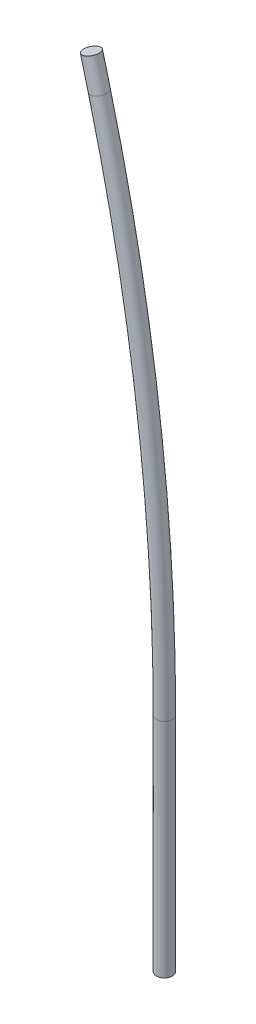
ISO-10303-21;
HEADER;
FILE_DESCRIPTION(('STEP AP214'),'2;1');
FILE_NAME('part.step','',(''),(''),'','','');
FILE_SCHEMA(('AUTOMOTIVE_DESIGN { 1 0 10303 214 1 1 1 1 }'));
ENDSEC;
DATA;
#1=APPLICATION_CONTEXT('core data for automotive mechanical design processes');
#2=APPLICATION_PROTOCOL_DEFINITION('international standard','automotive_design',2000,#1);
#3=PRODUCT_CONTEXT('',#1,'mechanical');
#4=PRODUCT('Part','Part','',(#3));
#5=PRODUCT_RELATED_PRODUCT_CATEGORY('part','',(#4));
#6=PRODUCT_DEFINITION_FORMATION('','',#4);
#7=PRODUCT_DEFINITION_CONTEXT('part definition',#1,'design');
#8=PRODUCT_DEFINITION('design','',#6,#7);
#9=PRODUCT_DEFINITION_SHAPE('','',#8);
#10=(LENGTH_UNIT() NAMED_UNIT(*) SI_UNIT(.MILLI.,.METRE.));
#11=(NAMED_UNIT(*) PLANE_ANGLE_UNIT() SI_UNIT($,.RADIAN.));
#12=(NAMED_UNIT(*) SI_UNIT($,.STERADIAN.) SOLID_ANGLE_UNIT());
#13=UNCERTAINTY_MEASURE_WITH_UNIT(LENGTH_MEASURE(1.E-05),#10,'distance_accuracy_value','');
#14=(GEOMETRIC_REPRESENTATION_CONTEXT(3) GLOBAL_UNCERTAINTY_ASSIGNED_CONTEXT((#13)) GLOBAL_UNIT_ASSIGNED_CONTEXT((#10,
#11,#12)) REPRESENTATION_CONTEXT('',''));
#15=CARTESIAN_POINT('',(0.,0.,0.));
#16=DIRECTION('',(0.,0.,1.));
#17=DIRECTION('',(1.,0.,0.));
#18=AXIS2_PLACEMENT_3D('',#15,#16,#17);
#19=CARTESIAN_POINT('',(-764.718109756101,0.,0.));
#20=DIRECTION('',(0.,0.,1.));
#21=DIRECTION('',(1.,0.,0.));
#22=AXIS2_PLACEMENT_3D('',#19,#20,#21);
#23=TOROIDAL_SURFACE('',#22,805.993109756101,3.175);
#24=CARTESIAN_POINT('',(41.275,0.,0.));
#25=DIRECTION('',(0.,-1.,0.));
#26=DIRECTION('',(0.,0.,-1.));
#27=AXIS2_PLACEMENT_3D('',#24,#25,#26);
#28=CIRCLE('',#27,3.175);
#29=CARTESIAN_POINT('',(44.45,0.,0.));
#30=VERTEX_POINT('',#29);
#31=EDGE_CURVE('E51',#30,#30,#28,.T.);
#32=CARTESIAN_POINT('',(15.2400000000001,203.2,0.));
#33=DIRECTION('',(-0.252111336363024,0.967698235028488,0.));
#34=DIRECTION('',(0.,0.,1.));
#35=AXIS2_PLACEMENT_3D('',#32,#33,#34);
#36=CIRCLE('',#35,3.175);
#37=CARTESIAN_POINT('',(18.3124418962156,204.000453492953,0.));
#38=VERTEX_POINT('',#37);
#39=EDGE_CURVE('E10',#38,#38,#36,.T.);
#40=CARTESIAN_POINT('',(-764.718109756101,0.,0.));
#41=DIRECTION('',(0.,0.,1.));
#42=DIRECTION('',(1.,0.,0.));
#43=AXIS2_PLACEMENT_3D('',#40,#41,#42);
#44=CIRCLE('',#43,809.168109756101);
#45=EDGE_CURVE('',#30,#38,#44,.T.);
#46=ORIENTED_EDGE('',*,*,#31,.F.);
#47=ORIENTED_EDGE('',*,*,#39,.F.);
#48=ORIENTED_EDGE('',*,*,#45,.T.);
#49=ORIENTED_EDGE('',*,*,#45,.F.);
#50=EDGE_LOOP('',(#46,#48,#47,#49));
#51=FACE_BOUND('',#50,.T.);
#52=ADVANCED_FACE('F37',(#51),#23,.T.);
#53=CARTESIAN_POINT('',(12.0381860281897,215.489767584862,0.));
#54=DIRECTION('',(0.252111336363024,-0.967698235028488,0.));
#55=DIRECTION('',(0.967698235028488,0.252111336363024,0.));
#56=AXIS2_PLACEMENT_3D('',#53,#54,#55);
#57=CYLINDRICAL_SURFACE('',#56,3.175);
#58=CARTESIAN_POINT('',(12.0381860281897,215.489767584862,0.));
#59=DIRECTION('',(-0.252111336363024,0.967698235028488,0.));
#60=DIRECTION('',(-0.967698235028488,-0.252111336363024,0.));
#61=AXIS2_PLACEMENT_3D('',#58,#59,#60);
#62=CIRCLE('',#61,3.175);
#63=CARTESIAN_POINT('',(15.1106279244051,216.290221077814,0.));
#64=VERTEX_POINT('',#63);
#65=EDGE_CURVE('E43',#64,#64,#62,.T.);
#66=CARTESIAN_POINT('',(15.1106279244051,216.290221077814,0.));
#67=CARTESIAN_POINT('',(15.1439801532782,216.162202665472,0.));
#68=CARTESIAN_POINT('',(15.1773323821512,216.03418425313,0.));
#69=CARTESIAN_POINT('',(15.2440368398972,215.778147428445,0.));
#70=CARTESIAN_POINT('',(15.2773890687703,215.650129016103,0.));
#71=CARTESIAN_POINT('',(15.3440935265163,215.394092191418,0.));
#72=CARTESIAN_POINT('',(15.3774457553893,215.266073779076,0.));
#73=CARTESIAN_POINT('',(15.4441502131354,215.010036954391,0.));
#74=CARTESIAN_POINT('',(15.4775024420084,214.882018542049,0.));
#75=CARTESIAN_POINT('',(15.5442068997545,214.625981717364,0.));
#76=CARTESIAN_POINT('',(15.5775591286275,214.497963305022,0.));
#77=CARTESIAN_POINT('',(15.6442635863735,214.241926480337,0.));
#78=CARTESIAN_POINT('',(15.6776158152466,214.113908067995,0.));
#79=CARTESIAN_POINT('',(15.7443202729926,213.857871243311,0.));
#80=CARTESIAN_POINT('',(15.7776725018656,213.729852830968,0.));
#81=CARTESIAN_POINT('',(15.8443769596117,213.473816006284,0.));
#82=CARTESIAN_POINT('',(15.8777291884847,213.345797593941,0.));
#83=CARTESIAN_POINT('',(15.9444336462308,213.089760769257,0.));
#84=CARTESIAN_POINT('',(15.9777858751038,212.961742356914,0.));
#85=CARTESIAN_POINT('',(16.0444903328498,212.70570553223,0.));
#86=CARTESIAN_POINT('',(16.0778425617229,212.577687119887,0.));
#87=CARTESIAN_POINT('',(16.1445470194689,212.321650295203,0.));
#88=CARTESIAN_POINT('',(16.1778992483419,212.19363188286,0.));
#89=CARTESIAN_POINT('',(16.244603706088,211.937595058176,0.));
#90=CARTESIAN_POINT('',(16.277955934961,211.809576645834,0.));
#91=CARTESIAN_POINT('',(16.3446603927071,211.553539821149,0.));
#92=CARTESIAN_POINT('',(16.3780126215801,211.425521408807,0.));
#93=CARTESIAN_POINT('',(16.4447170793261,211.169484584122,0.));
#94=CARTESIAN_POINT('',(16.4780693081992,211.04146617178,0.));
#95=CARTESIAN_POINT('',(16.5447737659452,210.785429347095,0.));
#96=CARTESIAN_POINT('',(16.5781259948182,210.657410934753,0.));
#97=CARTESIAN_POINT('',(16.6448304525643,210.401374110068,0.));
#98=CARTESIAN_POINT('',(16.6781826814373,210.273355697726,0.));
#99=CARTESIAN_POINT('',(16.7448871391834,210.017318873041,0.));
#100=CARTESIAN_POINT('',(16.7782393680564,209.889300460699,0.));
#101=CARTESIAN_POINT('',(16.8449438258024,209.633263636014,0.));
#102=CARTESIAN_POINT('',(16.8782960546755,209.505245223672,0.));
#103=CARTESIAN_POINT('',(16.9450005124215,209.249208398987,0.));
#104=CARTESIAN_POINT('',(16.9783527412945,209.121189986645,0.));
#105=CARTESIAN_POINT('',(17.0450571990406,208.86515316196,0.));
#106=CARTESIAN_POINT('',(17.0784094279136,208.737134749618,0.));
#107=CARTESIAN_POINT('',(17.1451138856597,208.481097924933,0.));
#108=CARTESIAN_POINT('',(17.1784661145327,208.353079512591,0.));
#109=CARTESIAN_POINT('',(17.2451705722787,208.097042687907,0.));
#110=CARTESIAN_POINT('',(17.2785228011518,207.969024275564,0.));
#111=CARTESIAN_POINT('',(17.3452272588978,207.71298745088,0.));
#112=CARTESIAN_POINT('',(17.3785794877708,207.584969038537,0.));
#113=CARTESIAN_POINT('',(17.4452839455169,207.328932213853,0.));
#114=CARTESIAN_POINT('',(17.4786361743899,207.20091380151,0.));
#115=CARTESIAN_POINT('',(17.545340632136,206.944876976826,0.));
#116=CARTESIAN_POINT('',(17.578692861009,206.816858564483,0.));
#117=CARTESIAN_POINT('',(17.645397318755,206.560821739799,0.));
#118=CARTESIAN_POINT('',(17.6787495476281,206.432803327456,0.));
#119=CARTESIAN_POINT('',(17.7454540053741,206.176766502772,0.));
#120=CARTESIAN_POINT('',(17.7788062342471,206.04874809043,0.));
#121=CARTESIAN_POINT('',(17.8455106919932,205.792711265745,0.));
#122=CARTESIAN_POINT('',(17.8788629208662,205.664692853403,0.));
#123=CARTESIAN_POINT('',(17.9455673786123,205.408656028718,0.));
#124=CARTESIAN_POINT('',(17.9789196074853,205.280637616376,0.));
#125=CARTESIAN_POINT('',(18.0456240652313,205.024600791691,0.));
#126=CARTESIAN_POINT('',(18.0789762941044,204.896582379349,0.));
#127=CARTESIAN_POINT('',(18.1456807518504,204.640545554664,0.));
#128=CARTESIAN_POINT('',(18.1790329807234,204.512527142322,0.));
#129=CARTESIAN_POINT('',(18.2457374384695,204.256490317637,0.));
#130=CARTESIAN_POINT('',(18.2790896673425,204.128471905295,0.));
#131=CARTESIAN_POINT('',(18.3124418962155,204.000453492953,0.));
#132=B_SPLINE_CURVE_WITH_KNOTS('',3,(#66,#67,#68,#69,#70,#71,#72,#73,#74,#75,#76,#77,#78,#79,
#80,#81,#82,#83,#84,#85,#86,#87,#88,#89,#90,#91,#92,#93,#94,#95,#96,#97,#98,#99,#100,#101,#102,
#103,#104,#105,#106,#107,#108,#109,#110,#111,#112,#113,#114,#115,#116,#117,#118,#119,#120,#121,
#122,#123,#124,#125,#126,#127,#128,#129,#130,#131),.UNSPECIFIED.,.F.,.F.,(4,2,2,2,2,2,2,2,2,2,2,
2,2,2,2,2,2,2,2,2,2,2,2,2,2,2,2,2,2,2,2,2,4),(0.,0.396875000000016,0.793750000000006,1.190625,
1.58750000000001,1.984375,2.38124999999999,2.77812500000001,3.175,3.57187500000001,3.96875,
4.36562499999999,4.76250000000001,5.15937499999999,5.55624999999998,5.953125,6.34999999999999,
6.74687500000001,7.14374999999999,7.54062499999998,7.9375,8.33437499999999,8.73125000000001,
9.128125,9.52499999999998,9.921875,10.31875,10.715625,11.1125,11.509375,11.90625,12.303125,
12.7),.UNSPECIFIED.);
#133=EDGE_CURVE('BSEAM60',#64,#38,#132,.T.);
#134=ORIENTED_EDGE('',*,*,#65,.F.);
#135=ORIENTED_EDGE('',*,*,#39,.T.);
#136=ORIENTED_EDGE('',*,*,#133,.T.);
#137=ORIENTED_EDGE('',*,*,#133,.F.);
#138=EDGE_LOOP('',(#134,#136,#135,#137));
#139=FACE_BOUND('',#138,.T.);
#140=ADVANCED_FACE('F60',(#139),#57,.T.);
#141=CARTESIAN_POINT('',(12.0381860281897,215.489767584862,0.));
#142=DIRECTION('',(-0.252111336363024,0.967698235028488,0.));
#143=DIRECTION('',(-0.967698235028488,-0.252111336363024,0.));
#144=AXIS2_PLACEMENT_3D('',#141,#142,#143);
#145=PLANE('',#144);
#146=ORIENTED_EDGE('',*,*,#65,.T.);
#147=EDGE_LOOP('',(#146));
#148=FACE_BOUND('',#147,.T.);
#149=ADVANCED_FACE('F65',(#148),#145,.T.);
#150=CARTESIAN_POINT('',(41.275,-88.9,0.));
#151=DIRECTION('',(0.,1.,0.));
#152=DIRECTION('',(0.,0.,1.));
#153=AXIS2_PLACEMENT_3D('',#150,#151,#152);
#154=CYLINDRICAL_SURFACE('',#153,3.175);
#155=CARTESIAN_POINT('',(41.275,-88.9,0.));
#156=DIRECTION('',(0.,-1.,0.));
#157=DIRECTION('',(0.,0.,-1.));
#158=AXIS2_PLACEMENT_3D('',#155,#156,#157);
#159=CIRCLE('',#158,3.175);
#160=CARTESIAN_POINT('',(41.275,-88.9,-3.175));
#161=VERTEX_POINT('',#160);
#162=EDGE_CURVE('E47',#161,#161,#159,.T.);
#163=ORIENTED_EDGE('',*,*,#162,.F.);
#164=EDGE_LOOP('',(#163));
#165=FACE_BOUND('',#164,.T.);
#166=ORIENTED_EDGE('',*,*,#31,.T.);
#167=EDGE_LOOP('',(#166));
#168=FACE_BOUND('',#167,.T.);
#169=ADVANCED_FACE('F57',(#165,#168),#154,.T.);
#170=CARTESIAN_POINT('',(41.275,-88.9,0.));
#171=DIRECTION('',(0.,-1.,0.));
#172=DIRECTION('',(0.,0.,-1.));
#173=AXIS2_PLACEMENT_3D('',#170,#171,#172);
#174=PLANE('',#173);
#175=ORIENTED_EDGE('',*,*,#162,.T.);
#176=EDGE_LOOP('',(#175));
#177=FACE_BOUND('',#176,.T.);
#178=ADVANCED_FACE('F74',(#177),#174,.T.);
#179=CLOSED_SHELL('',(#52,#140,#149,#169,#178));
#180=MANIFOLD_SOLID_BREP('B2',#179);
#181=ADVANCED_BREP_SHAPE_REPRESENTATION('',(#18,#180),#14);
#182=SHAPE_DEFINITION_REPRESENTATION(#9,#181);
ENDSEC;
END-ISO-10303-21;
